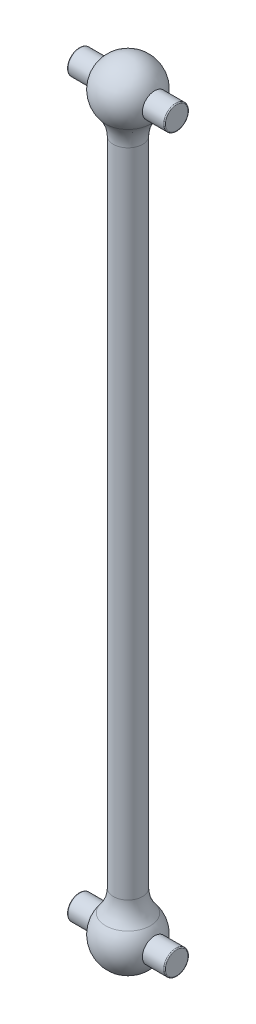
ISO-10303-21;
HEADER;
FILE_DESCRIPTION(('STEP AP214'),'2;1');
FILE_NAME('part.step','',(''),(''),'','','');
FILE_SCHEMA(('AUTOMOTIVE_DESIGN { 1 0 10303 214 1 1 1 1 }'));
ENDSEC;
DATA;
#1=APPLICATION_CONTEXT('core data for automotive mechanical design processes');
#2=APPLICATION_PROTOCOL_DEFINITION('international standard','automotive_design',2000,#1);
#3=PRODUCT_CONTEXT('',#1,'mechanical');
#4=PRODUCT('Part','Part','',(#3));
#5=PRODUCT_RELATED_PRODUCT_CATEGORY('part','',(#4));
#6=PRODUCT_DEFINITION_FORMATION('','',#4);
#7=PRODUCT_DEFINITION_CONTEXT('part definition',#1,'design');
#8=PRODUCT_DEFINITION('design','',#6,#7);
#9=PRODUCT_DEFINITION_SHAPE('','',#8);
#10=(LENGTH_UNIT() NAMED_UNIT(*) SI_UNIT(.MILLI.,.METRE.));
#11=(NAMED_UNIT(*) PLANE_ANGLE_UNIT() SI_UNIT($,.RADIAN.));
#12=(NAMED_UNIT(*) SI_UNIT($,.STERADIAN.) SOLID_ANGLE_UNIT());
#13=UNCERTAINTY_MEASURE_WITH_UNIT(LENGTH_MEASURE(1.E-05),#10,'distance_accuracy_value','');
#14=(GEOMETRIC_REPRESENTATION_CONTEXT(3) GLOBAL_UNCERTAINTY_ASSIGNED_CONTEXT((#13)) GLOBAL_UNIT_ASSIGNED_CONTEXT((#10,
#11,#12)) REPRESENTATION_CONTEXT('',''));
#15=CARTESIAN_POINT('',(0.,0.,0.));
#16=DIRECTION('',(0.,0.,1.));
#17=DIRECTION('',(1.,0.,0.));
#18=AXIS2_PLACEMENT_3D('',#15,#16,#17);
#19=CARTESIAN_POINT('',(0.,47.625,0.));
#20=DIRECTION('',(0.,-1.,0.));
#21=DIRECTION('',(0.,0.,-1.));
#22=AXIS2_PLACEMENT_3D('',#19,#20,#21);
#23=CYLINDRICAL_SURFACE('',#22,1.905);
#24=CARTESIAN_POINT('',(0.,42.3910555159389,0.));
#25=DIRECTION('',(0.,1.,0.));
#26=DIRECTION('',(-1.,0.,0.));
#27=AXIS2_PLACEMENT_3D('',#24,#25,#26);
#28=CIRCLE('',#27,1.905);
#29=CARTESIAN_POINT('',(-1.905,42.3910555159389,0.));
#30=VERTEX_POINT('',#29);
#31=EDGE_CURVE('E81',#30,#30,#28,.T.);
#32=ORIENTED_EDGE('',*,*,#31,.F.);
#33=EDGE_LOOP('',(#32));
#34=FACE_BOUND('',#33,.T.);
#35=CARTESIAN_POINT('',(0.,-42.3910555159389,0.));
#36=DIRECTION('',(0.,-1.,0.));
#37=DIRECTION('',(1.,0.,0.));
#38=AXIS2_PLACEMENT_3D('',#35,#36,#37);
#39=CIRCLE('',#38,1.905);
#40=CARTESIAN_POINT('',(1.905,-42.3910555159389,0.));
#41=VERTEX_POINT('',#40);
#42=EDGE_CURVE('E53',#41,#41,#39,.T.);
#43=ORIENTED_EDGE('',*,*,#42,.F.);
#44=EDGE_LOOP('',(#43));
#45=FACE_BOUND('',#44,.T.);
#46=ADVANCED_FACE('F33',(#34,#45),#23,.T.);
#47=CARTESIAN_POINT('',(0.,47.625,0.));
#48=DIRECTION('',(0.,1.,0.));
#49=DIRECTION('',(1.,0.,0.));
#50=AXIS2_PLACEMENT_3D('',#47,#48,#49);
#51=SPHERICAL_SURFACE('',#50,3.81);
#52=CARTESIAN_POINT('',(0.,45.1759792070943,0.));
#53=DIRECTION('',(0.,1.,0.));
#54=DIRECTION('',(-1.,0.,0.));
#55=AXIS2_PLACEMENT_3D('',#52,#53,#54);
#56=CIRCLE('',#55,2.91862932828331);
#57=CARTESIAN_POINT('',(-2.91862932828331,45.1759792070943,0.));
#58=VERTEX_POINT('',#57);
#59=EDGE_CURVE('E84',#58,#58,#56,.T.);
#60=ORIENTED_EDGE('',*,*,#59,.T.);
#61=EDGE_LOOP('',(#60));
#62=FACE_BOUND('',#61,.T.);
#63=CARTESIAN_POINT('',(3.46351609639684,47.625,0.));
#64=DIRECTION('',(-1.,0.,0.));
#65=DIRECTION('',(0.,0.,1.));
#66=AXIS2_PLACEMENT_3D('',#63,#64,#65);
#67=CIRCLE('',#66,1.5875);
#68=CARTESIAN_POINT('',(3.46351609639684,47.625,1.5875));
#69=VERTEX_POINT('',#68);
#70=EDGE_CURVE('E78',#69,#69,#67,.F.);
#71=ORIENTED_EDGE('',*,*,#70,.F.);
#72=EDGE_LOOP('',(#71));
#73=FACE_BOUND('',#72,.T.);
#74=CARTESIAN_POINT('',(-3.46351609639684,47.625,0.));
#75=DIRECTION('',(1.,0.,0.));
#76=DIRECTION('',(0.,0.,-1.));
#77=AXIS2_PLACEMENT_3D('',#74,#75,#76);
#78=CIRCLE('',#77,1.5875);
#79=CARTESIAN_POINT('',(-3.46351609639684,47.625,-1.5875));
#80=VERTEX_POINT('',#79);
#81=EDGE_CURVE('E75',#80,#80,#78,.F.);
#82=ORIENTED_EDGE('',*,*,#81,.F.);
#83=EDGE_LOOP('',(#82));
#84=FACE_BOUND('',#83,.T.);
#85=ADVANCED_FACE('F110',(#62,#73,#84),#51,.T.);
#86=CARTESIAN_POINT('',(0.,42.3910555159389,0.));
#87=DIRECTION('',(0.,1.,0.));
#88=DIRECTION('',(-1.,0.,0.));
#89=AXIS2_PLACEMENT_3D('',#86,#87,#88);
#90=TOROIDAL_SURFACE('',#89,6.23757214231842,4.33257214231842);
#91=ORIENTED_EDGE('',*,*,#59,.F.);
#92=EDGE_LOOP('',(#91));
#93=FACE_BOUND('',#92,.T.);
#94=ORIENTED_EDGE('',*,*,#31,.T.);
#95=EDGE_LOOP('',(#94));
#96=FACE_BOUND('',#95,.T.);
#97=ADVANCED_FACE('F116',(#93,#96),#90,.F.);
#98=CARTESIAN_POINT('',(6.35,47.625,0.));
#99=DIRECTION('',(1.,0.,0.));
#100=DIRECTION('',(0.,0.,-1.));
#101=AXIS2_PLACEMENT_3D('',#98,#99,#100);
#102=PLANE('',#101);
#103=CARTESIAN_POINT('',(6.35,47.625,0.));
#104=DIRECTION('',(1.,0.,0.));
#105=DIRECTION('',(0.,0.,-1.));
#106=AXIS2_PLACEMENT_3D('',#103,#104,#105);
#107=CIRCLE('',#106,1.4605);
#108=CARTESIAN_POINT('',(6.35,47.625,-1.4605));
#109=VERTEX_POINT('',#108);
#110=EDGE_CURVE('E66',#109,#109,#107,.T.);
#111=ORIENTED_EDGE('',*,*,#110,.T.);
#112=EDGE_LOOP('',(#111));
#113=FACE_BOUND('',#112,.T.);
#114=ADVANCED_FACE('F240',(#113),#102,.T.);
#115=CARTESIAN_POINT('',(6.35,47.625,0.));
#116=DIRECTION('',(-1.,0.,0.));
#117=DIRECTION('',(0.,0.,1.));
#118=AXIS2_PLACEMENT_3D('',#115,#116,#117);
#119=CYLINDRICAL_SURFACE('',#118,1.5875);
#120=CARTESIAN_POINT('',(6.223,47.625,0.));
#121=DIRECTION('',(1.,0.,0.));
#122=DIRECTION('',(0.,0.,-1.));
#123=AXIS2_PLACEMENT_3D('',#120,#121,#122);
#124=CIRCLE('',#123,1.5875);
#125=CARTESIAN_POINT('',(6.223,47.625,-1.5875));
#126=VERTEX_POINT('',#125);
#127=EDGE_CURVE('E63',#126,#126,#124,.F.);
#128=ORIENTED_EDGE('',*,*,#127,.T.);
#129=EDGE_LOOP('',(#128));
#130=FACE_BOUND('',#129,.T.);
#131=ORIENTED_EDGE('',*,*,#70,.T.);
#132=EDGE_LOOP('',(#131));
#133=FACE_BOUND('',#132,.T.);
#134=ADVANCED_FACE('F230',(#130,#133),#119,.T.);
#135=CARTESIAN_POINT('',(-6.223,47.625,0.));
#136=DIRECTION('',(1.,0.,0.));
#137=DIRECTION('',(0.,0.,-1.));
#138=AXIS2_PLACEMENT_3D('',#135,#136,#137);
#139=CIRCLE('',#138,1.5875);
#140=CARTESIAN_POINT('',(-6.223,47.625,-1.5875));
#141=VERTEX_POINT('',#140);
#142=EDGE_CURVE('E72',#141,#141,#139,.T.);
#143=ORIENTED_EDGE('',*,*,#142,.T.);
#144=EDGE_LOOP('',(#143));
#145=FACE_BOUND('',#144,.T.);
#146=ORIENTED_EDGE('',*,*,#81,.T.);
#147=EDGE_LOOP('',(#146));
#148=FACE_BOUND('',#147,.T.);
#149=ADVANCED_FACE('F220',(#145,#148),#119,.T.);
#150=CARTESIAN_POINT('',(-6.35,47.625,0.));
#151=DIRECTION('',(1.,0.,0.));
#152=DIRECTION('',(0.,0.,-1.));
#153=AXIS2_PLACEMENT_3D('',#150,#151,#152);
#154=PLANE('',#153);
#155=CARTESIAN_POINT('',(-6.35,47.625,0.));
#156=DIRECTION('',(1.,0.,0.));
#157=DIRECTION('',(0.,0.,-1.));
#158=AXIS2_PLACEMENT_3D('',#155,#156,#157);
#159=CIRCLE('',#158,1.4605);
#160=CARTESIAN_POINT('',(-6.35,47.625,-1.4605));
#161=VERTEX_POINT('',#160);
#162=EDGE_CURVE('E69',#161,#161,#159,.F.);
#163=ORIENTED_EDGE('',*,*,#162,.T.);
#164=EDGE_LOOP('',(#163));
#165=FACE_BOUND('',#164,.T.);
#166=ADVANCED_FACE('F124',(#165),#154,.F.);
#167=CARTESIAN_POINT('',(-6.223,47.625,0.));
#168=DIRECTION('',(1.,0.,0.));
#169=DIRECTION('',(0.,0.,-1.));
#170=AXIS2_PLACEMENT_3D('',#167,#168,#169);
#171=TOROIDAL_SURFACE('',#170,1.4605,0.127);
#172=ORIENTED_EDGE('',*,*,#162,.F.);
#173=EDGE_LOOP('',(#172));
#174=FACE_BOUND('',#173,.T.);
#175=ORIENTED_EDGE('',*,*,#142,.F.);
#176=EDGE_LOOP('',(#175));
#177=FACE_BOUND('',#176,.T.);
#178=ADVANCED_FACE('F104',(#174,#177),#171,.T.);
#179=CARTESIAN_POINT('',(6.223,47.625,0.));
#180=DIRECTION('',(1.,0.,0.));
#181=DIRECTION('',(0.,0.,-1.));
#182=AXIS2_PLACEMENT_3D('',#179,#180,#181);
#183=TOROIDAL_SURFACE('',#182,1.4605,0.127);
#184=ORIENTED_EDGE('',*,*,#127,.F.);
#185=EDGE_LOOP('',(#184));
#186=FACE_BOUND('',#185,.T.);
#187=ORIENTED_EDGE('',*,*,#110,.F.);
#188=EDGE_LOOP('',(#187));
#189=FACE_BOUND('',#188,.T.);
#190=ADVANCED_FACE('F95',(#186,#189),#183,.T.);
#191=CARTESIAN_POINT('',(0.,-47.625,0.));
#192=DIRECTION('',(0.,-1.,0.));
#193=DIRECTION('',(1.,0.,0.));
#194=AXIS2_PLACEMENT_3D('',#191,#192,#193);
#195=SPHERICAL_SURFACE('',#194,3.81);
#196=CARTESIAN_POINT('',(-3.46351609639684,-47.625,0.));
#197=DIRECTION('',(1.,0.,0.));
#198=DIRECTION('',(0.,0.,-1.));
#199=AXIS2_PLACEMENT_3D('',#196,#197,#198);
#200=CIRCLE('',#199,1.5875);
#201=CARTESIAN_POINT('',(-3.46351609639684,-47.625,-1.5875));
#202=VERTEX_POINT('',#201);
#203=EDGE_CURVE('E54',#202,#202,#200,.T.);
#204=ORIENTED_EDGE('',*,*,#203,.T.);
#205=EDGE_LOOP('',(#204));
#206=FACE_BOUND('',#205,.T.);
#207=CARTESIAN_POINT('',(3.46351609639684,-47.625,0.));
#208=DIRECTION('',(-1.,0.,0.));
#209=DIRECTION('',(0.,0.,1.));
#210=AXIS2_PLACEMENT_3D('',#207,#208,#209);
#211=CIRCLE('',#210,1.5875);
#212=CARTESIAN_POINT('',(3.46351609639684,-47.625,1.5875));
#213=VERTEX_POINT('',#212);
#214=EDGE_CURVE('E58',#213,#213,#211,.T.);
#215=ORIENTED_EDGE('',*,*,#214,.T.);
#216=EDGE_LOOP('',(#215));
#217=FACE_BOUND('',#216,.T.);
#218=CARTESIAN_POINT('',(0.,-45.1759792070943,0.));
#219=DIRECTION('',(0.,1.,0.));
#220=DIRECTION('',(-1.,0.,0.));
#221=AXIS2_PLACEMENT_3D('',#218,#219,#220);
#222=CIRCLE('',#221,2.91862932828331);
#223=CARTESIAN_POINT('',(-2.91862932828331,-45.1759792070943,0.));
#224=VERTEX_POINT('',#223);
#225=EDGE_CURVE('E57',#224,#224,#222,.T.);
#226=ORIENTED_EDGE('',*,*,#225,.F.);
#227=EDGE_LOOP('',(#226));
#228=FACE_BOUND('',#227,.T.);
#229=ADVANCED_FACE('F93',(#206,#217,#228),#195,.T.);
#230=CARTESIAN_POINT('',(0.,-42.3910555159389,0.));
#231=DIRECTION('',(0.,-1.,0.));
#232=DIRECTION('',(-1.,0.,0.));
#233=AXIS2_PLACEMENT_3D('',#230,#231,#232);
#234=TOROIDAL_SURFACE('',#233,6.23757214231842,4.33257214231842);
#235=ORIENTED_EDGE('',*,*,#225,.T.);
#236=EDGE_LOOP('',(#235));
#237=FACE_BOUND('',#236,.T.);
#238=ORIENTED_EDGE('',*,*,#42,.T.);
#239=EDGE_LOOP('',(#238));
#240=FACE_BOUND('',#239,.T.);
#241=ADVANCED_FACE('F90',(#237,#240),#234,.F.);
#242=CARTESIAN_POINT('',(6.35,-47.625,0.));
#243=DIRECTION('',(1.,0.,0.));
#244=DIRECTION('',(0.,0.,-1.));
#245=AXIS2_PLACEMENT_3D('',#242,#243,#244);
#246=PLANE('',#245);
#247=CARTESIAN_POINT('',(6.35,-47.625,0.));
#248=DIRECTION('',(1.,0.,0.));
#249=DIRECTION('',(0.,0.,-1.));
#250=AXIS2_PLACEMENT_3D('',#247,#248,#249);
#251=CIRCLE('',#250,1.4605);
#252=CARTESIAN_POINT('',(6.35,-47.625,-1.4605));
#253=VERTEX_POINT('',#252);
#254=EDGE_CURVE('E10',#253,#253,#251,.T.);
#255=ORIENTED_EDGE('',*,*,#254,.T.);
#256=EDGE_LOOP('',(#255));
#257=FACE_BOUND('',#256,.T.);
#258=ADVANCED_FACE('F102',(#257),#246,.T.);
#259=CARTESIAN_POINT('',(6.35,-47.625,0.));
#260=DIRECTION('',(-1.,0.,0.));
#261=DIRECTION('',(0.,0.,1.));
#262=AXIS2_PLACEMENT_3D('',#259,#260,#261);
#263=CYLINDRICAL_SURFACE('',#262,1.5875);
#264=CARTESIAN_POINT('',(6.223,-47.625,0.));
#265=DIRECTION('',(1.,0.,0.));
#266=DIRECTION('',(0.,0.,-1.));
#267=AXIS2_PLACEMENT_3D('',#264,#265,#266);
#268=CIRCLE('',#267,1.5875);
#269=CARTESIAN_POINT('',(6.223,-47.625,-1.5875));
#270=VERTEX_POINT('',#269);
#271=EDGE_CURVE('E40',#270,#270,#268,.F.);
#272=ORIENTED_EDGE('',*,*,#271,.T.);
#273=EDGE_LOOP('',(#272));
#274=FACE_BOUND('',#273,.T.);
#275=ORIENTED_EDGE('',*,*,#214,.F.);
#276=EDGE_LOOP('',(#275));
#277=FACE_BOUND('',#276,.T.);
#278=ADVANCED_FACE('F144',(#274,#277),#263,.T.);
#279=CARTESIAN_POINT('',(-6.223,-47.625,0.));
#280=DIRECTION('',(1.,0.,0.));
#281=DIRECTION('',(0.,0.,-1.));
#282=AXIS2_PLACEMENT_3D('',#279,#280,#281);
#283=CIRCLE('',#282,1.5875);
#284=CARTESIAN_POINT('',(-6.223,-47.625,-1.5875));
#285=VERTEX_POINT('',#284);
#286=EDGE_CURVE('E44',#285,#285,#283,.T.);
#287=ORIENTED_EDGE('',*,*,#286,.T.);
#288=EDGE_LOOP('',(#287));
#289=FACE_BOUND('',#288,.T.);
#290=ORIENTED_EDGE('',*,*,#203,.F.);
#291=EDGE_LOOP('',(#290));
#292=FACE_BOUND('',#291,.T.);
#293=ADVANCED_FACE('F135',(#289,#292),#263,.T.);
#294=CARTESIAN_POINT('',(-6.35,-47.625,0.));
#295=DIRECTION('',(1.,0.,0.));
#296=DIRECTION('',(0.,0.,-1.));
#297=AXIS2_PLACEMENT_3D('',#294,#295,#296);
#298=PLANE('',#297);
#299=CARTESIAN_POINT('',(-6.35,-47.625,0.));
#300=DIRECTION('',(1.,0.,0.));
#301=DIRECTION('',(0.,0.,-1.));
#302=AXIS2_PLACEMENT_3D('',#299,#300,#301);
#303=CIRCLE('',#302,1.4605);
#304=CARTESIAN_POINT('',(-6.35,-47.625,-1.4605));
#305=VERTEX_POINT('',#304);
#306=EDGE_CURVE('E48',#305,#305,#303,.F.);
#307=ORIENTED_EDGE('',*,*,#306,.T.);
#308=EDGE_LOOP('',(#307));
#309=FACE_BOUND('',#308,.T.);
#310=ADVANCED_FACE('F128',(#309),#298,.F.);
#311=CARTESIAN_POINT('',(-6.223,-47.625,0.));
#312=DIRECTION('',(1.,0.,0.));
#313=DIRECTION('',(0.,0.,-1.));
#314=AXIS2_PLACEMENT_3D('',#311,#312,#313);
#315=TOROIDAL_SURFACE('',#314,1.4605,0.127);
#316=ORIENTED_EDGE('',*,*,#286,.F.);
#317=EDGE_LOOP('',(#316));
#318=FACE_BOUND('',#317,.T.);
#319=ORIENTED_EDGE('',*,*,#306,.F.);
#320=EDGE_LOOP('',(#319));
#321=FACE_BOUND('',#320,.T.);
#322=ADVANCED_FACE('F126',(#318,#321),#315,.T.);
#323=CARTESIAN_POINT('',(6.223,-47.625,0.));
#324=DIRECTION('',(1.,0.,0.));
#325=DIRECTION('',(0.,0.,-1.));
#326=AXIS2_PLACEMENT_3D('',#323,#324,#325);
#327=TOROIDAL_SURFACE('',#326,1.4605,0.127);
#328=ORIENTED_EDGE('',*,*,#254,.F.);
#329=EDGE_LOOP('',(#328));
#330=FACE_BOUND('',#329,.T.);
#331=ORIENTED_EDGE('',*,*,#271,.F.);
#332=EDGE_LOOP('',(#331));
#333=FACE_BOUND('',#332,.T.);
#334=ADVANCED_FACE('F35',(#330,#333),#327,.T.);
#335=CLOSED_SHELL('',(#46,#85,#97,#114,#134,#149,#166,#178,#190,#229,#241,#258,#278,#293,#310,
#322,#334));
#336=MANIFOLD_SOLID_BREP('B2',#335);
#337=ADVANCED_BREP_SHAPE_REPRESENTATION('',(#18,#336),#14);
#338=SHAPE_DEFINITION_REPRESENTATION(#9,#337);
ENDSEC;
END-ISO-10303-21;
